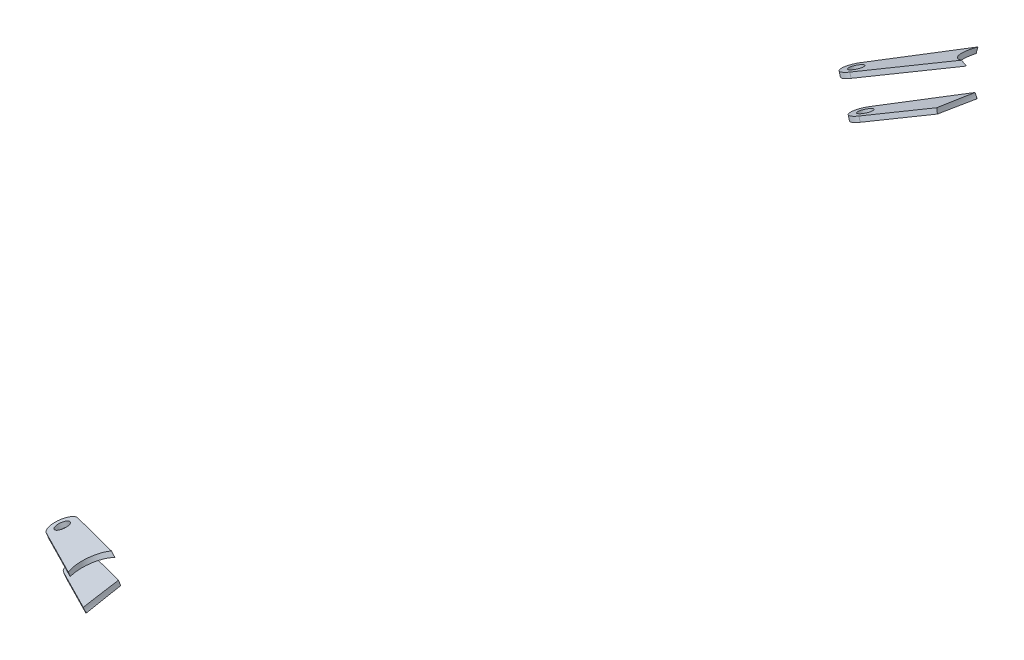
ISO-10303-21;
HEADER;
FILE_DESCRIPTION(('STEP AP214'),'2;1');
FILE_NAME('part.step','',(''),(''),'','','');
FILE_SCHEMA(('AUTOMOTIVE_DESIGN { 1 0 10303 214 1 1 1 1 }'));
ENDSEC;
DATA;
#1=APPLICATION_CONTEXT('core data for automotive mechanical design processes');
#2=APPLICATION_PROTOCOL_DEFINITION('international standard','automotive_design',2000,#1);
#3=PRODUCT_CONTEXT('',#1,'mechanical');
#4=PRODUCT('Part','Part','',(#3));
#5=PRODUCT_RELATED_PRODUCT_CATEGORY('part','',(#4));
#6=PRODUCT_DEFINITION_FORMATION('','',#4);
#7=PRODUCT_DEFINITION_CONTEXT('part definition',#1,'design');
#8=PRODUCT_DEFINITION('design','',#6,#7);
#9=PRODUCT_DEFINITION_SHAPE('','',#8);
#10=(LENGTH_UNIT() NAMED_UNIT(*) SI_UNIT(.MILLI.,.METRE.));
#11=(NAMED_UNIT(*) PLANE_ANGLE_UNIT() SI_UNIT($,.RADIAN.));
#12=(NAMED_UNIT(*) SI_UNIT($,.STERADIAN.) SOLID_ANGLE_UNIT());
#13=UNCERTAINTY_MEASURE_WITH_UNIT(LENGTH_MEASURE(1.E-05),#10,'distance_accuracy_value','');
#14=(GEOMETRIC_REPRESENTATION_CONTEXT(3) GLOBAL_UNCERTAINTY_ASSIGNED_CONTEXT((#13)) GLOBAL_UNIT_ASSIGNED_CONTEXT((#10,
#11,#12)) REPRESENTATION_CONTEXT('',''));
#15=CARTESIAN_POINT('',(0.,0.,0.));
#16=DIRECTION('',(0.,0.,1.));
#17=DIRECTION('',(1.,0.,0.));
#18=AXIS2_PLACEMENT_3D('',#15,#16,#17);
#19=CARTESIAN_POINT('',(-723.135401716286,128.133003214821,253.501979836922));
#20=DIRECTION('',(-0.405383190309539,0.9055830654316,0.124835013589804));
#21=DIRECTION('',(-0.912722826923479,-0.408579296113757,0.));
#22=AXIS2_PLACEMENT_3D('',#19,#20,#21);
#23=CYLINDRICAL_SURFACE('',#22,4.10000000000005);
#24=CARTESIAN_POINT('',(-723.135401716286,128.133003214821,253.501979836922));
#25=DIRECTION('',(-0.405383190309539,0.9055830654316,0.124835013589804));
#26=DIRECTION('',(0.912722826923479,0.408579296113757,0.));
#27=AXIS2_PLACEMENT_3D('',#24,#25,#26);
#28=CIRCLE('',#27,4.10000000000005);
#29=CARTESIAN_POINT('',(-719.393238125899,129.808178328888,253.501979836922));
#30=VERTEX_POINT('',#29);
#31=EDGE_CURVE('E135',#30,#30,#28,.T.);
#32=ORIENTED_EDGE('',*,*,#31,.F.);
#33=EDGE_LOOP('',(#32));
#34=FACE_BOUND('',#33,.T.);
#35=CARTESIAN_POINT('',(-724.351551287214,130.849752411116,253.876484877692));
#36=DIRECTION('',(-0.405383190309539,0.9055830654316,0.124835013589804));
#37=DIRECTION('',(0.912722826923479,0.408579296113757,0.));
#38=AXIS2_PLACEMENT_3D('',#35,#36,#37);
#39=CIRCLE('',#38,4.10000000000005);
#40=CARTESIAN_POINT('',(-720.609387696828,132.524927525183,253.876484877692));
#41=VERTEX_POINT('',#40);
#42=EDGE_CURVE('E123',#41,#41,#39,.T.);
#43=ORIENTED_EDGE('',*,*,#42,.T.);
#44=EDGE_LOOP('',(#43));
#45=FACE_BOUND('',#44,.T.);
#46=ADVANCED_FACE('F52',(#34,#45),#23,.F.);
#47=CARTESIAN_POINT('',(-723.135401716286,128.133003214821,253.501979836922));
#48=DIRECTION('',(-0.405383190309539,0.9055830654316,0.124835013589804));
#49=DIRECTION('',(-0.912722826923479,-0.408579296113757,0.));
#50=AXIS2_PLACEMENT_3D('',#47,#48,#49);
#51=CYLINDRICAL_SURFACE('',#50,8.00000000000009);
#52=CARTESIAN_POINT('',(-724.351551287214,130.849752411116,253.876484877692));
#53=DIRECTION('',(-0.405383190309539,0.9055830654316,0.124835013589804));
#54=DIRECTION('',(0.912722826923479,0.408579296113757,0.));
#55=AXIS2_PLACEMENT_3D('',#52,#53,#54);
#56=CIRCLE('',#55,8.00000000000009);
#57=CARTESIAN_POINT('',(-721.412607697438,133.141206407969,246.797512554224));
#58=VERTEX_POINT('',#57);
#59=CARTESIAN_POINT('',(-727.995069649261,128.301918278556,260.527297999288));
#60=VERTEX_POINT('',#59);
#61=EDGE_CURVE('E115',#58,#60,#56,.T.);
#62=ORIENTED_EDGE('',*,*,#61,.F.);
#63=DIRECTION('',(-0.405383190309539,0.9055830654316,0.124835013589804));
#64=VECTOR('',#63,1.);
#65=CARTESIAN_POINT('',(-720.19645812651,130.424457211674,246.423007513454));
#66=LINE('',#65,#64);
#67=CARTESIAN_POINT('',(-720.19645812651,130.424457211674,246.423007513454));
#68=VERTEX_POINT('',#67);
#69=EDGE_CURVE('E129',#68,#58,#66,.T.);
#70=ORIENTED_EDGE('',*,*,#69,.F.);
#71=CARTESIAN_POINT('',(-723.135401716286,128.133003214821,253.501979836922));
#72=DIRECTION('',(-0.405383190309539,0.9055830654316,0.124835013589804));
#73=DIRECTION('',(0.912722826923479,0.408579296113757,0.));
#74=AXIS2_PLACEMENT_3D('',#71,#72,#73);
#75=CIRCLE('',#74,8.00000000000009);
#76=CARTESIAN_POINT('',(-726.778920078332,125.585169082261,260.152792958518));
#77=VERTEX_POINT('',#76);
#78=EDGE_CURVE('E12',#68,#77,#75,.T.);
#79=ORIENTED_EDGE('',*,*,#78,.T.);
#80=DIRECTION('',(-0.405383190309539,0.9055830654316,0.124835013589804));
#81=VECTOR('',#80,1.);
#82=CARTESIAN_POINT('',(-726.778920078332,125.585169082261,260.152792958518));
#83=LINE('',#82,#81);
#84=EDGE_CURVE('E126',#77,#60,#83,.T.);
#85=ORIENTED_EDGE('',*,*,#84,.T.);
#86=EDGE_LOOP('',(#62,#70,#79,#85));
#87=FACE_BOUND('',#86,.T.);
#88=ADVANCED_FACE('F150',(#87),#51,.T.);
#89=CARTESIAN_POINT('',(-342.282932156797,271.666249022261,449.03936727097));
#90=DIRECTION('',(0.367367948721989,0.28643174960655,-0.884871540433485));
#91=DIRECTION('',(0.923568459891075,0.,0.383433566468075));
#92=AXIS2_PLACEMENT_3D('',#89,#90,#91);
#93=PLANE('',#92);
#94=DIRECTION('',(0.837081393453622,0.312851665203875,0.448796809606424));
#95=VECTOR('',#94,1.);
#96=CARTESIAN_POINT('',(-342.282932156797,271.666249022261,449.03936727097));
#97=LINE('',#96,#95);
#98=CARTESIAN_POINT('',(-687.647262102726,142.589427376731,263.874088668727));
#99=VERTEX_POINT('',#98);
#100=EDGE_CURVE('E132',#68,#99,#97,.T.);
#101=ORIENTED_EDGE('',*,*,#100,.F.);
#102=ORIENTED_EDGE('',*,*,#69,.T.);
#103=DIRECTION('',(0.837081393453622,0.312851665203875,0.448796809606424));
#104=VECTOR('',#103,1.);
#105=CARTESIAN_POINT('',(-343.499081727726,274.382998218555,449.413872311739));
#106=LINE('',#105,#104);
#107=CARTESIAN_POINT('',(-688.64246045726,145.388755109018,264.367055548181));
#108=VERTEX_POINT('',#107);
#109=EDGE_CURVE('E116',#58,#108,#106,.T.);
#110=ORIENTED_EDGE('',*,*,#109,.T.);
#111=CARTESIAN_POINT('',(-676.260714615963,148.214063927805,270.422075372678));
#112=DIRECTION('',(-0.367367948721989,-0.28643174960655,0.884871540433485));
#113=DIRECTION('',(0.69782940423287,0.544088012785731,0.465835117751841));
#114=AXIS2_PLACEMENT_3D('',#111,#112,#113);
#115=ELLIPSE('',#114,14.352365761225,12.7);
#116=EDGE_CURVE('E117',#99,#108,#115,.F.);
#117=ORIENTED_EDGE('',*,*,#116,.F.);
#118=EDGE_LOOP('',(#101,#102,#110,#117));
#119=FACE_BOUND('',#118,.T.);
#120=ADVANCED_FACE('F152',(#119),#93,.T.);
#121=CARTESIAN_POINT('',(-179.920385092426,401.923063808397,55.4052665601296));
#122=DIRECTION('',(0.405383190309539,-0.9055830654316,-0.124835013589804));
#123=DIRECTION('',(0.912722826923479,0.408579296113757,0.));
#124=AXIS2_PLACEMENT_3D('',#121,#122,#123);
#125=PLANE('',#124);
#126=CARTESIAN_POINT('',(-676.260714615963,148.214063927805,284.079472273869));
#127=DIRECTION('',(-0.405383190309539,0.9055830654316,0.124835013589804));
#128=DIRECTION('',(0.0510050019828735,-0.113939766502717,0.99217751404778));
#129=AXIS2_PLACEMENT_3D('',#126,#127,#128);
#130=ELLIPSE('',#129,101.734278186815,12.7);
#131=CARTESIAN_POINT('',(-687.636303718546,142.56729736904,288.101930024843));
#132=VERTEX_POINT('',#131);
#133=EDGE_CURVE('E107',#132,#108,#130,.F.);
#134=ORIENTED_EDGE('',*,*,#133,.T.);
#135=ORIENTED_EDGE('',*,*,#109,.F.);
#136=ORIENTED_EDGE('',*,*,#61,.T.);
#137=DIRECTION('',(-0.792615330353773,-0.280161147143036,-0.541544707036896));
#138=VECTOR('',#137,1.);
#139=CARTESIAN_POINT('',(-410.958717786264,240.362920157407,477.138498558658));
#140=LINE('',#139,#138);
#141=EDGE_CURVE('E56',#132,#60,#140,.T.);
#142=ORIENTED_EDGE('',*,*,#141,.F.);
#143=EDGE_LOOP('',(#134,#135,#136,#142));
#144=FACE_BOUND('',#143,.T.);
#145=ORIENTED_EDGE('',*,*,#42,.F.);
#146=EDGE_LOOP('',(#145));
#147=FACE_BOUND('',#146,.T.);
#148=ADVANCED_FACE('F111',(#144,#147),#125,.F.);
#149=CARTESIAN_POINT('',(-676.260714615963,148.214063927805,-291.982195578493));
#150=DIRECTION('',(0.,0.,1.));
#151=DIRECTION('',(-1.,0.,0.));
#152=AXIS2_PLACEMENT_3D('',#149,#150,#151);
#153=CYLINDRICAL_SURFACE('',#152,12.7);
#154=CARTESIAN_POINT('',(-676.260714615963,148.214063927805,291.982195578493));
#155=DIRECTION('',(-0.143288404120598,0.617337174610734,-0.773539427623575));
#156=DIRECTION('',(-0.174894751333007,0.753508508276034,0.633748178626015));
#157=AXIS2_PLACEMENT_3D('',#154,#155,#156);
#158=ELLIPSE('',#157,16.4180383655637,12.7);
#159=CARTESIAN_POINT('',(-686.020470303491,140.087738256275,287.304705351432));
#160=VERTEX_POINT('',#159);
#161=CARTESIAN_POINT('',(-686.596866626299,140.834771169064,288.007658656125));
#162=VERTEX_POINT('',#161);
#163=EDGE_CURVE('E121',#160,#162,#158,.T.);
#164=ORIENTED_EDGE('',*,*,#163,.F.);
#165=CARTESIAN_POINT('',(-676.260714615963,148.214063927805,260.047753017142));
#166=DIRECTION('',(-0.405383190309539,0.9055830654316,0.124835013589804));
#167=DIRECTION('',(0.0510050019828735,-0.113939766502717,0.99217751404778));
#168=AXIS2_PLACEMENT_3D('',#165,#166,#167);
#169=ELLIPSE('',#168,101.734278186815,12.7);
#170=EDGE_CURVE('E62',#160,#99,#169,.F.);
#171=ORIENTED_EDGE('',*,*,#170,.T.);
#172=ORIENTED_EDGE('',*,*,#116,.T.);
#173=ORIENTED_EDGE('',*,*,#133,.F.);
#174=CARTESIAN_POINT('',(-676.260714615963,148.214063927805,296.497022674504));
#175=DIRECTION('',(0.455439795255794,0.318479266570062,-0.831351640199474));
#176=DIRECTION('',(0.681300647595598,0.476418909414996,0.555746750181811));
#177=AXIS2_PLACEMENT_3D('',#174,#175,#176);
#178=ELLIPSE('',#177,15.2763275922001,12.7);
#179=EDGE_CURVE('E96',#132,#162,#178,.F.);
#180=ORIENTED_EDGE('',*,*,#179,.T.);
#181=EDGE_LOOP('',(#164,#171,#172,#173,#180));
#182=FACE_BOUND('',#181,.T.);
#183=ADVANCED_FACE('F118',(#182),#153,.F.);
#184=CARTESIAN_POINT('',(-409.742568215335,237.646170961112,476.763993517889));
#185=DIRECTION('',(-0.455439795255794,-0.318479266570062,0.831351640199474));
#186=DIRECTION('',(-0.877018125804204,0.,-0.480457289476266));
#187=AXIS2_PLACEMENT_3D('',#184,#185,#186);
#188=PLANE('',#187);
#189=ORIENTED_EDGE('',*,*,#179,.F.);
#190=ORIENTED_EDGE('',*,*,#141,.T.);
#191=ORIENTED_EDGE('',*,*,#84,.F.);
#192=DIRECTION('',(-0.792615330353773,-0.280161147143036,-0.541544707036896));
#193=VECTOR('',#192,1.);
#194=CARTESIAN_POINT('',(-409.742568215335,237.646170961112,476.763993517889));
#195=LINE('',#194,#193);
#196=CARTESIAN_POINT('',(-686.232874586171,139.916744793934,287.855381448393));
#197=VERTEX_POINT('',#196);
#198=EDGE_CURVE('E128',#197,#77,#195,.T.);
#199=ORIENTED_EDGE('',*,*,#198,.F.);
#200=CARTESIAN_POINT('',(-673.992049395208,138.439850961207,293.99550147373));
#201=DIRECTION('',(0.455439795255794,0.318479266570062,-0.831351640199474));
#202=DIRECTION('',(-0.417830240767277,0.901053090893115,0.116280769228294));
#203=AXIS2_PLACEMENT_3D('',#200,#201,#202);
#204=ELLIPSE('',#203,34.6277885790125,12.7);
#205=EDGE_CURVE('E102',#162,#197,#204,.F.);
#206=ORIENTED_EDGE('',*,*,#205,.F.);
#207=EDGE_LOOP('',(#189,#190,#191,#199,#206));
#208=FACE_BOUND('',#207,.T.);
#209=ADVANCED_FACE('F98',(#208),#188,.T.);
#210=CARTESIAN_POINT('',(-178.704235521497,399.206314612102,55.0307615193602));
#211=DIRECTION('',(0.405383190309539,-0.9055830654316,-0.124835013589804));
#212=DIRECTION('',(0.912722826923479,0.408579296113757,0.));
#213=AXIS2_PLACEMENT_3D('',#210,#211,#212);
#214=PLANE('',#213);
#215=ORIENTED_EDGE('',*,*,#31,.T.);
#216=EDGE_LOOP('',(#215));
#217=FACE_BOUND('',#216,.T.);
#218=ORIENTED_EDGE('',*,*,#198,.T.);
#219=ORIENTED_EDGE('',*,*,#78,.F.);
#220=ORIENTED_EDGE('',*,*,#100,.T.);
#221=ORIENTED_EDGE('',*,*,#170,.F.);
#222=CARTESIAN_POINT('',(-675.310673341131,144.120949764326,292.825300890745));
#223=DIRECTION('',(-0.405383190309539,0.9055830654316,0.124835013589804));
#224=DIRECTION('',(0.423400282953569,0.307028627372305,-0.852329526866643));
#225=AXIS2_PLACEMENT_3D('',#222,#223,#224);
#226=ELLIPSE('',#225,13.6529640296189,12.7);
#227=EDGE_CURVE('E69',#197,#160,#226,.F.);
#228=ORIENTED_EDGE('',*,*,#227,.F.);
#229=EDGE_LOOP('',(#218,#219,#220,#221,#228));
#230=FACE_BOUND('',#229,.T.);
#231=ADVANCED_FACE('F54',(#217,#230),#214,.T.);
#232=CARTESIAN_POINT('',(-676.260714615963,148.214063927805,291.982195578494));
#233=DIRECTION('',(-0.221678460217085,0.955069289398282,-0.196726492176431));
#234=DIRECTION('',(-0.97410485020902,-0.226096750970159,0.));
#235=AXIS2_PLACEMENT_3D('',#232,#233,#234);
#236=CYLINDRICAL_SURFACE('',#235,12.7);
#237=ORIENTED_EDGE('',*,*,#205,.T.);
#238=ORIENTED_EDGE('',*,*,#227,.T.);
#239=ORIENTED_EDGE('',*,*,#163,.T.);
#240=EDGE_LOOP('',(#237,#238,#239));
#241=FACE_BOUND('',#240,.T.);
#242=ADVANCED_FACE('F146',(#241),#236,.F.);
#243=CLOSED_SHELL('',(#46,#88,#120,#148,#183,#209,#231,#242));
#244=MANIFOLD_SOLID_BREP('B2',#243);
#245=CARTESIAN_POINT('',(-419.471764782764,259.380164531471,479.760033844044));
#246=DIRECTION('',(-0.455439795255794,-0.318479266570062,0.831351640199474));
#247=DIRECTION('',(-0.637395705653935,-0.535291080076917,-0.554247394223924));
#248=AXIS2_PLACEMENT_3D('',#245,#246,#247);
#249=PLANE('',#248);
#250=DIRECTION('',(-0.792615330353772,-0.280161147143037,-0.541544707036896));
#251=VECTOR('',#250,1.);
#252=CARTESIAN_POINT('',(-419.471764782764,259.380164531471,479.760033844044));
#253=LINE('',#252,#251);
#254=CARTESIAN_POINT('',(-691.538553287296,163.214293587578,293.873736124576));
#255=VERTEX_POINT('',#254);
#256=CARTESIAN_POINT('',(-736.508116645761,147.319162652619,263.148833284673));
#257=VERTEX_POINT('',#256);
#258=EDGE_CURVE('E307',#255,#257,#253,.T.);
#259=ORIENTED_EDGE('',*,*,#258,.T.);
#260=DIRECTION('',(0.40538319030954,-0.9055830654316,-0.124835013589804));
#261=VECTOR('',#260,1.);
#262=CARTESIAN_POINT('',(-736.508116645761,147.319162652619,263.148833284673));
#263=LINE('',#262,#261);
#264=CARTESIAN_POINT('',(-735.291967074832,144.602413456324,262.774328243904));
#265=VERTEX_POINT('',#264);
#266=EDGE_CURVE('E299',#257,#265,#263,.T.);
#267=ORIENTED_EDGE('',*,*,#266,.T.);
#268=DIRECTION('',(-0.792615330353772,-0.280161147143037,-0.541544707036896));
#269=VECTOR('',#268,1.);
#270=CARTESIAN_POINT('',(-418.255615211836,256.663415335176,479.385528803275));
#271=LINE('',#270,#269);
#272=CARTESIAN_POINT('',(-691.502976842537,160.080254050499,292.692618969123));
#273=VERTEX_POINT('',#272);
#274=EDGE_CURVE('E288',#273,#265,#271,.T.);
#275=ORIENTED_EDGE('',*,*,#274,.F.);
#276=CARTESIAN_POINT('',(-673.992049395208,138.439850961207,293.99550147373));
#277=DIRECTION('',(0.455439795255794,0.318479266570062,-0.831351640199474));
#278=DIRECTION('',(-0.417830240767277,0.901053090893115,0.116280769228294));
#279=AXIS2_PLACEMENT_3D('',#276,#277,#278);
#280=ELLIPSE('',#279,34.6277885790125,12.7);
#281=EDGE_CURVE('E292',#255,#273,#280,.F.);
#282=ORIENTED_EDGE('',*,*,#281,.F.);
#283=EDGE_LOOP('',(#259,#267,#275,#282));
#284=FACE_BOUND('',#283,.T.);
#285=ADVANCED_FACE('F243',(#284),#249,.T.);
#286=CARTESIAN_POINT('',(-188.433432088926,420.940308182461,58.0268018455155));
#287=DIRECTION('',(-0.40538319030954,0.9055830654316,0.124835013589803));
#288=DIRECTION('',(0.912722826923479,0.408579296113757,0.));
#289=AXIS2_PLACEMENT_3D('',#286,#287,#288);
#290=PLANE('',#289);
#291=CARTESIAN_POINT('',(-732.864598283714,149.86699678518,256.498020163078));
#292=DIRECTION('',(-0.40538319030954,0.9055830654316,0.124835013589803));
#293=DIRECTION('',(0.912722826923479,0.408579296113757,0.));
#294=AXIS2_PLACEMENT_3D('',#291,#292,#293);
#295=CIRCLE('',#294,4.10000000000005);
#296=CARTESIAN_POINT('',(-729.122434693328,151.542171899246,256.498020163078));
#297=VERTEX_POINT('',#296);
#298=EDGE_CURVE('E300',#297,#297,#295,.T.);
#299=ORIENTED_EDGE('',*,*,#298,.F.);
#300=EDGE_LOOP('',(#299));
#301=FACE_BOUND('',#300,.T.);
#302=DIRECTION('',(0.837081393453622,0.312851665203875,0.448796809606424));
#303=VECTOR('',#302,1.);
#304=CARTESIAN_POINT('',(-352.012128724226,293.400242592619,452.035407597125));
#305=LINE('',#304,#303);
#306=CARTESIAN_POINT('',(-729.925654693939,152.158450782032,249.41904783961));
#307=VERTEX_POINT('',#306);
#308=CARTESIAN_POINT('',(-682.909083565255,169.730472672398,274.626736466075));
#309=VERTEX_POINT('',#308);
#310=EDGE_CURVE('E303',#307,#309,#305,.T.);
#311=ORIENTED_EDGE('',*,*,#310,.F.);
#312=CARTESIAN_POINT('',(-732.864598283714,149.86699678518,256.498020163078));
#313=DIRECTION('',(-0.40538319030954,0.9055830654316,0.124835013589803));
#314=DIRECTION('',(0.912722826923479,0.408579296113757,0.));
#315=AXIS2_PLACEMENT_3D('',#312,#313,#314);
#316=CIRCLE('',#315,8.00000000000009);
#317=EDGE_CURVE('E314',#307,#257,#316,.T.);
#318=ORIENTED_EDGE('',*,*,#317,.T.);
#319=ORIENTED_EDGE('',*,*,#258,.F.);
#320=CARTESIAN_POINT('',(-681.030172005985,168.762574937142,287.749584881879));
#321=DIRECTION('',(0.40538319030954,-0.9055830654316,-0.124835013589803));
#322=DIRECTION('',(0.42340028295357,0.307028627372305,-0.852329526866643));
#323=AXIS2_PLACEMENT_3D('',#320,#321,#322);
#324=ELLIPSE('',#323,13.6529640296189,12.7);
#325=EDGE_CURVE('E293',#309,#255,#324,.F.);
#326=ORIENTED_EDGE('',*,*,#325,.F.);
#327=EDGE_LOOP('',(#311,#318,#319,#326));
#328=FACE_BOUND('',#327,.T.);
#329=ADVANCED_FACE('F335',(#301,#328),#290,.T.);
#330=CARTESIAN_POINT('',(-187.217282517997,418.223558986166,57.6522968047461));
#331=DIRECTION('',(-0.40538319030954,0.9055830654316,0.124835013589803));
#332=DIRECTION('',(0.912722826923479,0.408579296113757,0.));
#333=AXIS2_PLACEMENT_3D('',#330,#331,#332);
#334=PLANE('',#333);
#335=CARTESIAN_POINT('',(-680.315234672878,165.68237179054,288.384049382988));
#336=DIRECTION('',(0.40538319030954,-0.9055830654316,-0.124835013589803));
#337=DIRECTION('',(0.42340028295357,0.307028627372305,-0.852329526866643));
#338=AXIS2_PLACEMENT_3D('',#335,#336,#337);
#339=ELLIPSE('',#338,13.6529640296189,12.7);
#340=CARTESIAN_POINT('',(-680.149753040607,167.590473520791,275.079599819933));
#341=VERTEX_POINT('',#340);
#342=EDGE_CURVE('E50',#341,#273,#339,.F.);
#343=ORIENTED_EDGE('',*,*,#342,.T.);
#344=ORIENTED_EDGE('',*,*,#274,.T.);
#345=CARTESIAN_POINT('',(-731.648448712786,147.150247588885,256.123515122308));
#346=DIRECTION('',(-0.40538319030954,0.9055830654316,0.124835013589803));
#347=DIRECTION('',(0.912722826923479,0.408579296113757,0.));
#348=AXIS2_PLACEMENT_3D('',#345,#346,#347);
#349=CIRCLE('',#348,8.00000000000009);
#350=CARTESIAN_POINT('',(-728.70950512301,149.441701585737,249.04454279884));
#351=VERTEX_POINT('',#350);
#352=EDGE_CURVE('E309',#351,#265,#349,.T.);
#353=ORIENTED_EDGE('',*,*,#352,.F.);
#354=DIRECTION('',(0.837081393453622,0.312851665203875,0.448796809606424));
#355=VECTOR('',#354,1.);
#356=CARTESIAN_POINT('',(-350.795979153297,290.683493396324,451.660902556356));
#357=LINE('',#356,#355);
#358=EDGE_CURVE('E290',#351,#341,#357,.T.);
#359=ORIENTED_EDGE('',*,*,#358,.T.);
#360=EDGE_LOOP('',(#343,#344,#353,#359));
#361=FACE_BOUND('',#360,.T.);
#362=CARTESIAN_POINT('',(-731.648448712786,147.150247588885,256.123515122308));
#363=DIRECTION('',(-0.40538319030954,0.9055830654316,0.124835013589803));
#364=DIRECTION('',(0.912722826923479,0.408579296113757,0.));
#365=AXIS2_PLACEMENT_3D('',#362,#363,#364);
#366=CIRCLE('',#365,4.10000000000005);
#367=CARTESIAN_POINT('',(-727.9062851224,148.825422702951,256.123515122308));
#368=VERTEX_POINT('',#367);
#369=EDGE_CURVE('E310',#368,#368,#366,.T.);
#370=ORIENTED_EDGE('',*,*,#369,.T.);
#371=EDGE_LOOP('',(#370));
#372=FACE_BOUND('',#371,.T.);
#373=ADVANCED_FACE('F284',(#361,#372),#334,.F.);
#374=CARTESIAN_POINT('',(-732.864598283714,149.86699678518,256.498020163078));
#375=DIRECTION('',(0.40538319030954,-0.9055830654316,-0.124835013589804));
#376=DIRECTION('',(-0.912722826923479,-0.408579296113757,0.));
#377=AXIS2_PLACEMENT_3D('',#374,#375,#376);
#378=CYLINDRICAL_SURFACE('',#377,8.00000000000009);
#379=ORIENTED_EDGE('',*,*,#352,.T.);
#380=ORIENTED_EDGE('',*,*,#266,.F.);
#381=ORIENTED_EDGE('',*,*,#317,.F.);
#382=DIRECTION('',(0.40538319030954,-0.9055830654316,-0.124835013589804));
#383=VECTOR('',#382,1.);
#384=CARTESIAN_POINT('',(-729.925654693939,152.158450782032,249.41904783961));
#385=LINE('',#384,#383);
#386=EDGE_CURVE('E253',#307,#351,#385,.T.);
#387=ORIENTED_EDGE('',*,*,#386,.T.);
#388=EDGE_LOOP('',(#379,#380,#381,#387));
#389=FACE_BOUND('',#388,.T.);
#390=ADVANCED_FACE('F323',(#389),#378,.T.);
#391=CARTESIAN_POINT('',(-732.864598283714,149.86699678518,256.498020163078));
#392=DIRECTION('',(0.40538319030954,-0.9055830654316,-0.124835013589804));
#393=DIRECTION('',(-0.912722826923479,-0.408579296113757,0.));
#394=AXIS2_PLACEMENT_3D('',#391,#392,#393);
#395=CYLINDRICAL_SURFACE('',#394,4.10000000000005);
#396=ORIENTED_EDGE('',*,*,#298,.T.);
#397=EDGE_LOOP('',(#396));
#398=FACE_BOUND('',#397,.T.);
#399=ORIENTED_EDGE('',*,*,#369,.F.);
#400=EDGE_LOOP('',(#399));
#401=FACE_BOUND('',#400,.T.);
#402=ADVANCED_FACE('F326',(#398,#401),#395,.F.);
#403=CARTESIAN_POINT('',(-352.012128724226,293.400242592619,452.035407597125));
#404=DIRECTION('',(0.367367948721989,0.28643174960655,-0.884871540433485));
#405=DIRECTION('',(0.658826323829652,0.591405862044624,0.464959117953785));
#406=AXIS2_PLACEMENT_3D('',#403,#404,#405);
#407=PLANE('',#406);
#408=ORIENTED_EDGE('',*,*,#358,.F.);
#409=ORIENTED_EDGE('',*,*,#386,.F.);
#410=ORIENTED_EDGE('',*,*,#310,.T.);
#411=CARTESIAN_POINT('',(-687.809434746994,197.970038947669,281.73339107904));
#412=DIRECTION('',(-0.367367948721989,-0.28643174960655,0.884871540433485));
#413=DIRECTION('',(-0.382800579522227,0.913643315180279,0.136819621925503));
#414=AXIS2_PLACEMENT_3D('',#411,#412,#413);
#415=ELLIPSE('',#414,34.6802864845066,12.7);
#416=EDGE_CURVE('E247',#341,#309,#415,.F.);
#417=ORIENTED_EDGE('',*,*,#416,.F.);
#418=EDGE_LOOP('',(#408,#409,#410,#417));
#419=FACE_BOUND('',#418,.T.);
#420=ADVANCED_FACE('F324',(#419),#407,.T.);
#421=CARTESIAN_POINT('',(-676.260714615963,148.214063927805,291.982195578494));
#422=DIRECTION('',(-0.221678460217085,0.955069289398282,-0.196726492176431));
#423=DIRECTION('',(-0.97410485020902,-0.226096750970159,0.));
#424=AXIS2_PLACEMENT_3D('',#421,#422,#423);
#425=CYLINDRICAL_SURFACE('',#424,12.7);
#426=ORIENTED_EDGE('',*,*,#416,.T.);
#427=ORIENTED_EDGE('',*,*,#325,.T.);
#428=ORIENTED_EDGE('',*,*,#281,.T.);
#429=ORIENTED_EDGE('',*,*,#342,.F.);
#430=EDGE_LOOP('',(#426,#427,#428,#429));
#431=FACE_BOUND('',#430,.T.);
#432=ADVANCED_FACE('F245',(#431),#425,.F.);
#433=CLOSED_SHELL('',(#285,#329,#373,#390,#402,#420,#432));
#434=MANIFOLD_SOLID_BREP('B6',#433);
#435=CARTESIAN_POINT('',(-723.135401716286,128.133003214821,-253.501979836922));
#436=DIRECTION('',(-0.405383190309539,0.9055830654316,-0.124835013589804));
#437=DIRECTION('',(-0.912722826923479,-0.408579296113757,0.));
#438=AXIS2_PLACEMENT_3D('',#435,#436,#437);
#439=CYLINDRICAL_SURFACE('',#438,4.10000000000005);
#440=CARTESIAN_POINT('',(-723.135401716286,128.133003214821,-253.501979836922));
#441=DIRECTION('',(0.405383190309539,-0.9055830654316,0.124835013589804));
#442=DIRECTION('',(0.912722826923479,0.408579296113757,0.));
#443=AXIS2_PLACEMENT_3D('',#440,#441,#442);
#444=CIRCLE('',#443,4.10000000000005);
#445=CARTESIAN_POINT('',(-719.393238125899,129.808178328888,-253.501979836922));
#446=VERTEX_POINT('',#445);
#447=EDGE_CURVE('E500',#446,#446,#444,.T.);
#448=ORIENTED_EDGE('',*,*,#447,.T.);
#449=EDGE_LOOP('',(#448));
#450=FACE_BOUND('',#449,.T.);
#451=CARTESIAN_POINT('',(-724.351551287214,130.849752411116,-253.876484877692));
#452=DIRECTION('',(0.405383190309539,-0.9055830654316,0.124835013589804));
#453=DIRECTION('',(0.912722826923479,0.408579296113757,0.));
#454=AXIS2_PLACEMENT_3D('',#451,#452,#453);
#455=CIRCLE('',#454,4.10000000000005);
#456=CARTESIAN_POINT('',(-720.609387696828,132.524927525183,-253.876484877692));
#457=VERTEX_POINT('',#456);
#458=EDGE_CURVE('E475',#457,#457,#455,.T.);
#459=ORIENTED_EDGE('',*,*,#458,.F.);
#460=EDGE_LOOP('',(#459));
#461=FACE_BOUND('',#460,.T.);
#462=ADVANCED_FACE('F405',(#450,#461),#439,.F.);
#463=CARTESIAN_POINT('',(-723.135401716286,128.133003214821,-253.501979836922));
#464=DIRECTION('',(-0.405383190309539,0.9055830654316,-0.124835013589804));
#465=DIRECTION('',(-0.912722826923479,-0.408579296113757,0.));
#466=AXIS2_PLACEMENT_3D('',#463,#464,#465);
#467=CYLINDRICAL_SURFACE('',#466,8.00000000000009);
#468=CARTESIAN_POINT('',(-724.351551287214,130.849752411116,-253.876484877692));
#469=DIRECTION('',(0.405383190309539,-0.9055830654316,0.124835013589804));
#470=DIRECTION('',(0.912722826923479,0.408579296113757,0.));
#471=AXIS2_PLACEMENT_3D('',#468,#469,#470);
#472=CIRCLE('',#471,8.00000000000009);
#473=CARTESIAN_POINT('',(-721.412607697438,133.141206407969,-246.797512554224));
#474=VERTEX_POINT('',#473);
#475=CARTESIAN_POINT('',(-727.995069649261,128.301918278556,-260.527297999288));
#476=VERTEX_POINT('',#475);
#477=EDGE_CURVE('E495',#474,#476,#472,.T.);
#478=ORIENTED_EDGE('',*,*,#477,.T.);
#479=DIRECTION('',(-0.405383190309539,0.9055830654316,-0.124835013589804));
#480=VECTOR('',#479,1.);
#481=CARTESIAN_POINT('',(-726.778920078332,125.585169082261,-260.152792958518));
#482=LINE('',#481,#480);
#483=CARTESIAN_POINT('',(-726.778920078332,125.585169082261,-260.152792958518));
#484=VERTEX_POINT('',#483);
#485=EDGE_CURVE('E472',#484,#476,#482,.T.);
#486=ORIENTED_EDGE('',*,*,#485,.F.);
#487=CARTESIAN_POINT('',(-723.135401716286,128.133003214821,-253.501979836922));
#488=DIRECTION('',(0.405383190309539,-0.9055830654316,0.124835013589804));
#489=DIRECTION('',(0.912722826923479,0.408579296113757,0.));
#490=AXIS2_PLACEMENT_3D('',#487,#488,#489);
#491=CIRCLE('',#490,8.00000000000009);
#492=CARTESIAN_POINT('',(-720.19645812651,130.424457211674,-246.423007513454));
#493=VERTEX_POINT('',#492);
#494=EDGE_CURVE('E241',#493,#484,#491,.T.);
#495=ORIENTED_EDGE('',*,*,#494,.F.);
#496=DIRECTION('',(-0.405383190309539,0.9055830654316,-0.124835013589804));
#497=VECTOR('',#496,1.);
#498=CARTESIAN_POINT('',(-720.19645812651,130.424457211674,-246.423007513454));
#499=LINE('',#498,#497);
#500=EDGE_CURVE('E481',#493,#474,#499,.T.);
#501=ORIENTED_EDGE('',*,*,#500,.T.);
#502=EDGE_LOOP('',(#478,#486,#495,#501));
#503=FACE_BOUND('',#502,.T.);
#504=ADVANCED_FACE('F494',(#503),#467,.T.);
#505=CARTESIAN_POINT('',(-342.282932156797,271.666249022261,-449.03936727097));
#506=DIRECTION('',(0.367367948721989,0.28643174960655,0.884871540433485));
#507=DIRECTION('',(0.923568459891075,0.,-0.383433566468075));
#508=AXIS2_PLACEMENT_3D('',#505,#506,#507);
#509=PLANE('',#508);
#510=DIRECTION('',(0.837081393453622,0.312851665203875,-0.448796809606424));
#511=VECTOR('',#510,1.);
#512=CARTESIAN_POINT('',(-342.282932156797,271.666249022261,-449.03936727097));
#513=LINE('',#512,#511);
#514=CARTESIAN_POINT('',(-687.647262102726,142.589427376731,-263.874088668727));
#515=VERTEX_POINT('',#514);
#516=EDGE_CURVE('E477',#493,#515,#513,.T.);
#517=ORIENTED_EDGE('',*,*,#516,.T.);
#518=CARTESIAN_POINT('',(-676.260714615963,148.214063927805,-270.422075372678));
#519=DIRECTION('',(0.367367948721989,0.28643174960655,0.884871540433485));
#520=DIRECTION('',(0.69782940423287,0.544088012785731,-0.465835117751841));
#521=AXIS2_PLACEMENT_3D('',#518,#519,#520);
#522=ELLIPSE('',#521,14.352365761225,12.7);
#523=CARTESIAN_POINT('',(-688.64246045726,145.388755109018,-264.367055548181));
#524=VERTEX_POINT('',#523);
#525=EDGE_CURVE('E474',#515,#524,#522,.F.);
#526=ORIENTED_EDGE('',*,*,#525,.T.);
#527=DIRECTION('',(0.837081393453622,0.312851665203875,-0.448796809606424));
#528=VECTOR('',#527,1.);
#529=CARTESIAN_POINT('',(-343.499081727726,274.382998218555,-449.413872311739));
#530=LINE('',#529,#528);
#531=EDGE_CURVE('E468',#474,#524,#530,.T.);
#532=ORIENTED_EDGE('',*,*,#531,.F.);
#533=ORIENTED_EDGE('',*,*,#500,.F.);
#534=EDGE_LOOP('',(#517,#526,#532,#533));
#535=FACE_BOUND('',#534,.T.);
#536=ADVANCED_FACE('F504',(#535),#509,.T.);
#537=CARTESIAN_POINT('',(-179.920385092426,401.923063808397,-55.4052665601296));
#538=DIRECTION('',(0.405383190309539,-0.9055830654316,0.124835013589804));
#539=DIRECTION('',(0.912722826923479,0.408579296113757,0.));
#540=AXIS2_PLACEMENT_3D('',#537,#538,#539);
#541=PLANE('',#540);
#542=CARTESIAN_POINT('',(-676.260714615963,148.214063927805,-284.079472273869));
#543=DIRECTION('',(0.405383190309539,-0.9055830654316,0.124835013589804));
#544=DIRECTION('',(0.0510050019828735,-0.113939766502717,-0.99217751404778));
#545=AXIS2_PLACEMENT_3D('',#542,#543,#544);
#546=ELLIPSE('',#545,101.734278186815,12.7);
#547=CARTESIAN_POINT('',(-687.636303718546,142.56729736904,-288.101930024843));
#548=VERTEX_POINT('',#547);
#549=EDGE_CURVE('E453',#548,#524,#546,.F.);
#550=ORIENTED_EDGE('',*,*,#549,.F.);
#551=DIRECTION('',(-0.792615330353773,-0.280161147143036,0.541544707036896));
#552=VECTOR('',#551,1.);
#553=CARTESIAN_POINT('',(-410.958717786264,240.362920157407,-477.138498558658));
#554=LINE('',#553,#552);
#555=EDGE_CURVE('E409',#548,#476,#554,.T.);
#556=ORIENTED_EDGE('',*,*,#555,.T.);
#557=ORIENTED_EDGE('',*,*,#477,.F.);
#558=ORIENTED_EDGE('',*,*,#531,.T.);
#559=EDGE_LOOP('',(#550,#556,#557,#558));
#560=FACE_BOUND('',#559,.T.);
#561=ORIENTED_EDGE('',*,*,#458,.T.);
#562=EDGE_LOOP('',(#561));
#563=FACE_BOUND('',#562,.T.);
#564=ADVANCED_FACE('F463',(#560,#563),#541,.F.);
#565=CARTESIAN_POINT('',(-676.260714615963,148.214063927805,291.982195578493));
#566=DIRECTION('',(0.,0.,-1.));
#567=DIRECTION('',(-1.,0.,0.));
#568=AXIS2_PLACEMENT_3D('',#565,#566,#567);
#569=CYLINDRICAL_SURFACE('',#568,12.7);
#570=CARTESIAN_POINT('',(-676.260714615963,148.214063927805,-291.982195578493));
#571=DIRECTION('',(0.143288404120598,-0.617337174610734,-0.773539427623575));
#572=DIRECTION('',(-0.174894751333007,0.753508508276034,-0.633748178626015));
#573=AXIS2_PLACEMENT_3D('',#570,#571,#572);
#574=ELLIPSE('',#573,16.4180383655637,12.7);
#575=CARTESIAN_POINT('',(-686.020470303491,140.087738256275,-287.304705351432));
#576=VERTEX_POINT('',#575);
#577=CARTESIAN_POINT('',(-686.596866626299,140.834771169064,-288.007658656125));
#578=VERTEX_POINT('',#577);
#579=EDGE_CURVE('E456',#576,#578,#574,.T.);
#580=ORIENTED_EDGE('',*,*,#579,.T.);
#581=CARTESIAN_POINT('',(-676.260714615963,148.214063927805,-296.497022674504));
#582=DIRECTION('',(-0.455439795255794,-0.318479266570062,-0.831351640199474));
#583=DIRECTION('',(0.681300647595598,0.476418909414996,-0.555746750181811));
#584=AXIS2_PLACEMENT_3D('',#581,#582,#583);
#585=ELLIPSE('',#584,15.2763275922001,12.7);
#586=EDGE_CURVE('E450',#548,#578,#585,.F.);
#587=ORIENTED_EDGE('',*,*,#586,.F.);
#588=ORIENTED_EDGE('',*,*,#549,.T.);
#589=ORIENTED_EDGE('',*,*,#525,.F.);
#590=CARTESIAN_POINT('',(-676.260714615963,148.214063927805,-260.047753017142));
#591=DIRECTION('',(0.405383190309539,-0.9055830654316,0.124835013589804));
#592=DIRECTION('',(0.0510050019828735,-0.113939766502717,-0.99217751404778));
#593=AXIS2_PLACEMENT_3D('',#590,#591,#592);
#594=ELLIPSE('',#593,101.734278186815,12.7);
#595=EDGE_CURVE('E415',#576,#515,#594,.F.);
#596=ORIENTED_EDGE('',*,*,#595,.F.);
#597=EDGE_LOOP('',(#580,#587,#588,#589,#596));
#598=FACE_BOUND('',#597,.T.);
#599=ADVANCED_FACE('F452',(#598),#569,.F.);
#600=CARTESIAN_POINT('',(-409.742568215335,237.646170961112,-476.763993517889));
#601=DIRECTION('',(-0.455439795255794,-0.318479266570062,-0.831351640199474));
#602=DIRECTION('',(-0.877018125804204,0.,0.480457289476266));
#603=AXIS2_PLACEMENT_3D('',#600,#601,#602);
#604=PLANE('',#603);
#605=ORIENTED_EDGE('',*,*,#586,.T.);
#606=CARTESIAN_POINT('',(-673.992049395208,138.439850961207,-293.99550147373));
#607=DIRECTION('',(-0.455439795255794,-0.318479266570062,-0.831351640199474));
#608=DIRECTION('',(-0.417830240767277,0.901053090893115,-0.116280769228294));
#609=AXIS2_PLACEMENT_3D('',#606,#607,#608);
#610=ELLIPSE('',#609,34.6277885790125,12.7);
#611=CARTESIAN_POINT('',(-686.232874586171,139.916744793934,-287.855381448393));
#612=VERTEX_POINT('',#611);
#613=EDGE_CURVE('E459',#578,#612,#610,.F.);
#614=ORIENTED_EDGE('',*,*,#613,.T.);
#615=DIRECTION('',(-0.792615330353773,-0.280161147143036,0.541544707036896));
#616=VECTOR('',#615,1.);
#617=CARTESIAN_POINT('',(-409.742568215335,237.646170961112,-476.763993517889));
#618=LINE('',#617,#616);
#619=EDGE_CURVE('E486',#612,#484,#618,.T.);
#620=ORIENTED_EDGE('',*,*,#619,.T.);
#621=ORIENTED_EDGE('',*,*,#485,.T.);
#622=ORIENTED_EDGE('',*,*,#555,.F.);
#623=EDGE_LOOP('',(#605,#614,#620,#621,#622));
#624=FACE_BOUND('',#623,.T.);
#625=ADVANCED_FACE('F470',(#624),#604,.T.);
#626=CARTESIAN_POINT('',(-178.704235521497,399.206314612102,-55.0307615193602));
#627=DIRECTION('',(0.405383190309539,-0.9055830654316,0.124835013589804));
#628=DIRECTION('',(0.912722826923479,0.408579296113757,0.));
#629=AXIS2_PLACEMENT_3D('',#626,#627,#628);
#630=PLANE('',#629);
#631=ORIENTED_EDGE('',*,*,#447,.F.);
#632=EDGE_LOOP('',(#631));
#633=FACE_BOUND('',#632,.T.);
#634=ORIENTED_EDGE('',*,*,#619,.F.);
#635=CARTESIAN_POINT('',(-675.310673341131,144.120949764326,-292.825300890745));
#636=DIRECTION('',(0.405383190309539,-0.9055830654316,0.124835013589804));
#637=DIRECTION('',(0.423400282953569,0.307028627372305,0.852329526866643));
#638=AXIS2_PLACEMENT_3D('',#635,#636,#637);
#639=ELLIPSE('',#638,13.6529640296189,12.7);
#640=EDGE_CURVE('E422',#612,#576,#639,.F.);
#641=ORIENTED_EDGE('',*,*,#640,.T.);
#642=ORIENTED_EDGE('',*,*,#595,.T.);
#643=ORIENTED_EDGE('',*,*,#516,.F.);
#644=ORIENTED_EDGE('',*,*,#494,.T.);
#645=EDGE_LOOP('',(#634,#641,#642,#643,#644));
#646=FACE_BOUND('',#645,.T.);
#647=ADVANCED_FACE('F407',(#633,#646),#630,.T.);
#648=CARTESIAN_POINT('',(-676.260714615963,148.214063927805,-291.982195578494));
#649=DIRECTION('',(-0.221678460217085,0.955069289398282,0.196726492176431));
#650=DIRECTION('',(-0.97410485020902,-0.226096750970159,0.));
#651=AXIS2_PLACEMENT_3D('',#648,#649,#650);
#652=CYLINDRICAL_SURFACE('',#651,12.7);
#653=ORIENTED_EDGE('',*,*,#613,.F.);
#654=ORIENTED_EDGE('',*,*,#579,.F.);
#655=ORIENTED_EDGE('',*,*,#640,.F.);
#656=EDGE_LOOP('',(#653,#654,#655));
#657=FACE_BOUND('',#656,.T.);
#658=ADVANCED_FACE('F523',(#657),#652,.F.);
#659=CLOSED_SHELL('',(#462,#504,#536,#564,#599,#625,#647,#658));
#660=MANIFOLD_SOLID_BREP('B44',#659);
#661=CARTESIAN_POINT('',(-419.471764782764,259.380164531471,-479.760033844044));
#662=DIRECTION('',(-0.455439795255794,-0.318479266570062,-0.831351640199474));
#663=DIRECTION('',(-0.637395705653935,-0.535291080076917,0.554247394223924));
#664=AXIS2_PLACEMENT_3D('',#661,#662,#663);
#665=PLANE('',#664);
#666=DIRECTION('',(-0.792615330353772,-0.280161147143037,0.541544707036896));
#667=VECTOR('',#666,1.);
#668=CARTESIAN_POINT('',(-419.471764782764,259.380164531471,-479.760033844044));
#669=LINE('',#668,#667);
#670=CARTESIAN_POINT('',(-691.538553287296,163.214293587578,-293.873736124576));
#671=VERTEX_POINT('',#670);
#672=CARTESIAN_POINT('',(-736.508116645761,147.319162652619,-263.148833284673));
#673=VERTEX_POINT('',#672);
#674=EDGE_CURVE('E632',#671,#673,#669,.T.);
#675=ORIENTED_EDGE('',*,*,#674,.F.);
#676=CARTESIAN_POINT('',(-673.992049395208,138.439850961207,-293.99550147373));
#677=DIRECTION('',(-0.455439795255794,-0.318479266570062,-0.831351640199474));
#678=DIRECTION('',(-0.417830240767277,0.901053090893115,-0.116280769228294));
#679=AXIS2_PLACEMENT_3D('',#676,#677,#678);
#680=ELLIPSE('',#679,34.6277885790125,12.7);
#681=CARTESIAN_POINT('',(-691.502976842537,160.080254050499,-292.692618969123));
#682=VERTEX_POINT('',#681);
#683=EDGE_CURVE('E623',#671,#682,#680,.F.);
#684=ORIENTED_EDGE('',*,*,#683,.T.);
#685=DIRECTION('',(-0.792615330353772,-0.280161147143037,0.541544707036896));
#686=VECTOR('',#685,1.);
#687=CARTESIAN_POINT('',(-418.255615211836,256.663415335176,-479.385528803275));
#688=LINE('',#687,#686);
#689=CARTESIAN_POINT('',(-735.291967074832,144.602413456324,-262.774328243904));
#690=VERTEX_POINT('',#689);
#691=EDGE_CURVE('E630',#682,#690,#688,.T.);
#692=ORIENTED_EDGE('',*,*,#691,.T.);
#693=DIRECTION('',(0.40538319030954,-0.9055830654316,0.124835013589804));
#694=VECTOR('',#693,1.);
#695=CARTESIAN_POINT('',(-736.508116645761,147.319162652619,-263.148833284673));
#696=LINE('',#695,#694);
#697=EDGE_CURVE('E653',#673,#690,#696,.T.);
#698=ORIENTED_EDGE('',*,*,#697,.F.);
#699=EDGE_LOOP('',(#675,#684,#692,#698));
#700=FACE_BOUND('',#699,.T.);
#701=ADVANCED_FACE('F586',(#700),#665,.T.);
#702=CARTESIAN_POINT('',(-188.433432088926,420.940308182461,-58.0268018455155));
#703=DIRECTION('',(-0.40538319030954,0.9055830654316,-0.124835013589803));
#704=DIRECTION('',(0.912722826923479,0.408579296113757,0.));
#705=AXIS2_PLACEMENT_3D('',#702,#703,#704);
#706=PLANE('',#705);
#707=CARTESIAN_POINT('',(-732.864598283714,149.86699678518,-256.498020163078));
#708=DIRECTION('',(0.40538319030954,-0.9055830654316,0.124835013589803));
#709=DIRECTION('',(0.912722826923479,0.408579296113757,0.));
#710=AXIS2_PLACEMENT_3D('',#707,#708,#709);
#711=CIRCLE('',#710,4.10000000000005);
#712=CARTESIAN_POINT('',(-729.122434693328,151.542171899246,-256.498020163078));
#713=VERTEX_POINT('',#712);
#714=EDGE_CURVE('E639',#713,#713,#711,.T.);
#715=ORIENTED_EDGE('',*,*,#714,.T.);
#716=EDGE_LOOP('',(#715));
#717=FACE_BOUND('',#716,.T.);
#718=DIRECTION('',(0.837081393453622,0.312851665203875,-0.448796809606424));
#719=VECTOR('',#718,1.);
#720=CARTESIAN_POINT('',(-352.012128724226,293.400242592619,-452.035407597125));
#721=LINE('',#720,#719);
#722=CARTESIAN_POINT('',(-729.925654693939,152.158450782032,-249.41904783961));
#723=VERTEX_POINT('',#722);
#724=CARTESIAN_POINT('',(-682.909083565255,169.730472672398,-274.626736466075));
#725=VERTEX_POINT('',#724);
#726=EDGE_CURVE('E642',#723,#725,#721,.T.);
#727=ORIENTED_EDGE('',*,*,#726,.T.);
#728=CARTESIAN_POINT('',(-681.030172005985,168.762574937142,-287.749584881879));
#729=DIRECTION('',(-0.40538319030954,0.9055830654316,-0.124835013589803));
#730=DIRECTION('',(0.42340028295357,0.307028627372305,0.852329526866643));
#731=AXIS2_PLACEMENT_3D('',#728,#729,#730);
#732=ELLIPSE('',#731,13.6529640296189,12.7);
#733=EDGE_CURVE('E604',#725,#671,#732,.F.);
#734=ORIENTED_EDGE('',*,*,#733,.T.);
#735=ORIENTED_EDGE('',*,*,#674,.T.);
#736=CARTESIAN_POINT('',(-732.864598283714,149.86699678518,-256.498020163078));
#737=DIRECTION('',(0.40538319030954,-0.9055830654316,0.124835013589803));
#738=DIRECTION('',(0.912722826923479,0.408579296113757,0.));
#739=AXIS2_PLACEMENT_3D('',#736,#737,#738);
#740=CIRCLE('',#739,8.00000000000009);
#741=EDGE_CURVE('E657',#723,#673,#740,.T.);
#742=ORIENTED_EDGE('',*,*,#741,.F.);
#743=EDGE_LOOP('',(#727,#734,#735,#742));
#744=FACE_BOUND('',#743,.T.);
#745=ADVANCED_FACE('F668',(#717,#744),#706,.T.);
#746=CARTESIAN_POINT('',(-187.217282517997,418.223558986166,-57.6522968047461));
#747=DIRECTION('',(-0.40538319030954,0.9055830654316,-0.124835013589803));
#748=DIRECTION('',(0.912722826923479,0.408579296113757,0.));
#749=AXIS2_PLACEMENT_3D('',#746,#747,#748);
#750=PLANE('',#749);
#751=CARTESIAN_POINT('',(-680.315234672878,165.68237179054,-288.384049382988));
#752=DIRECTION('',(-0.40538319030954,0.9055830654316,-0.124835013589803));
#753=DIRECTION('',(0.42340028295357,0.307028627372305,0.852329526866643));
#754=AXIS2_PLACEMENT_3D('',#751,#752,#753);
#755=ELLIPSE('',#754,13.6529640296189,12.7);
#756=CARTESIAN_POINT('',(-680.149753040607,167.590473520791,-275.079599819933));
#757=VERTEX_POINT('',#756);
#758=EDGE_CURVE('E403',#757,#682,#755,.F.);
#759=ORIENTED_EDGE('',*,*,#758,.F.);
#760=DIRECTION('',(0.837081393453622,0.312851665203875,-0.448796809606424));
#761=VECTOR('',#760,1.);
#762=CARTESIAN_POINT('',(-350.795979153297,290.683493396324,-451.660902556356));
#763=LINE('',#762,#761);
#764=CARTESIAN_POINT('',(-728.70950512301,149.441701585737,-249.04454279884));
#765=VERTEX_POINT('',#764);
#766=EDGE_CURVE('E648',#765,#757,#763,.T.);
#767=ORIENTED_EDGE('',*,*,#766,.F.);
#768=CARTESIAN_POINT('',(-731.648448712786,147.150247588885,-256.123515122308));
#769=DIRECTION('',(0.40538319030954,-0.9055830654316,0.124835013589803));
#770=DIRECTION('',(0.912722826923479,0.408579296113757,0.));
#771=AXIS2_PLACEMENT_3D('',#768,#769,#770);
#772=CIRCLE('',#771,8.00000000000009);
#773=EDGE_CURVE('E638',#765,#690,#772,.T.);
#774=ORIENTED_EDGE('',*,*,#773,.T.);
#775=ORIENTED_EDGE('',*,*,#691,.F.);
#776=EDGE_LOOP('',(#759,#767,#774,#775));
#777=FACE_BOUND('',#776,.T.);
#778=CARTESIAN_POINT('',(-731.648448712786,147.150247588885,-256.123515122308));
#779=DIRECTION('',(0.40538319030954,-0.9055830654316,0.124835013589803));
#780=DIRECTION('',(0.912722826923479,0.408579296113757,0.));
#781=AXIS2_PLACEMENT_3D('',#778,#779,#780);
#782=CIRCLE('',#781,4.10000000000005);
#783=CARTESIAN_POINT('',(-727.9062851224,148.825422702951,-256.123515122308));
#784=VERTEX_POINT('',#783);
#785=EDGE_CURVE('E649',#784,#784,#782,.T.);
#786=ORIENTED_EDGE('',*,*,#785,.F.);
#787=EDGE_LOOP('',(#786));
#788=FACE_BOUND('',#787,.T.);
#789=ADVANCED_FACE('F635',(#777,#788),#750,.F.);
#790=CARTESIAN_POINT('',(-732.864598283714,149.86699678518,-256.498020163078));
#791=DIRECTION('',(0.40538319030954,-0.9055830654316,0.124835013589804));
#792=DIRECTION('',(-0.912722826923479,-0.408579296113757,0.));
#793=AXIS2_PLACEMENT_3D('',#790,#791,#792);
#794=CYLINDRICAL_SURFACE('',#793,8.00000000000009);
#795=ORIENTED_EDGE('',*,*,#773,.F.);
#796=DIRECTION('',(0.40538319030954,-0.9055830654316,0.124835013589804));
#797=VECTOR('',#796,1.);
#798=CARTESIAN_POINT('',(-729.925654693939,152.158450782032,-249.41904783961));
#799=LINE('',#798,#797);
#800=EDGE_CURVE('E596',#723,#765,#799,.T.);
#801=ORIENTED_EDGE('',*,*,#800,.F.);
#802=ORIENTED_EDGE('',*,*,#741,.T.);
#803=ORIENTED_EDGE('',*,*,#697,.T.);
#804=EDGE_LOOP('',(#795,#801,#802,#803));
#805=FACE_BOUND('',#804,.T.);
#806=ADVANCED_FACE('F666',(#805),#794,.T.);
#807=CARTESIAN_POINT('',(-732.864598283714,149.86699678518,-256.498020163078));
#808=DIRECTION('',(0.40538319030954,-0.9055830654316,0.124835013589804));
#809=DIRECTION('',(-0.912722826923479,-0.408579296113757,0.));
#810=AXIS2_PLACEMENT_3D('',#807,#808,#809);
#811=CYLINDRICAL_SURFACE('',#810,4.10000000000005);
#812=ORIENTED_EDGE('',*,*,#714,.F.);
#813=EDGE_LOOP('',(#812));
#814=FACE_BOUND('',#813,.T.);
#815=ORIENTED_EDGE('',*,*,#785,.T.);
#816=EDGE_LOOP('',(#815));
#817=FACE_BOUND('',#816,.T.);
#818=ADVANCED_FACE('F671',(#814,#817),#811,.F.);
#819=CARTESIAN_POINT('',(-352.012128724226,293.400242592619,-452.035407597125));
#820=DIRECTION('',(0.367367948721989,0.28643174960655,0.884871540433485));
#821=DIRECTION('',(0.658826323829652,0.591405862044624,-0.464959117953785));
#822=AXIS2_PLACEMENT_3D('',#819,#820,#821);
#823=PLANE('',#822);
#824=ORIENTED_EDGE('',*,*,#766,.T.);
#825=CARTESIAN_POINT('',(-687.809434746994,197.970038947669,-281.73339107904));
#826=DIRECTION('',(0.367367948721989,0.28643174960655,0.884871540433485));
#827=DIRECTION('',(-0.382800579522227,0.913643315180279,-0.136819621925503));
#828=AXIS2_PLACEMENT_3D('',#825,#826,#827);
#829=ELLIPSE('',#828,34.6802864845066,12.7);
#830=EDGE_CURVE('E590',#757,#725,#829,.F.);
#831=ORIENTED_EDGE('',*,*,#830,.T.);
#832=ORIENTED_EDGE('',*,*,#726,.F.);
#833=ORIENTED_EDGE('',*,*,#800,.T.);
#834=EDGE_LOOP('',(#824,#831,#832,#833));
#835=FACE_BOUND('',#834,.T.);
#836=ADVANCED_FACE('F669',(#835),#823,.T.);
#837=CARTESIAN_POINT('',(-676.260714615963,148.214063927805,-291.982195578494));
#838=DIRECTION('',(-0.221678460217085,0.955069289398282,0.196726492176431));
#839=DIRECTION('',(-0.97410485020902,-0.226096750970159,0.));
#840=AXIS2_PLACEMENT_3D('',#837,#838,#839);
#841=CYLINDRICAL_SURFACE('',#840,12.7);
#842=ORIENTED_EDGE('',*,*,#830,.F.);
#843=ORIENTED_EDGE('',*,*,#758,.T.);
#844=ORIENTED_EDGE('',*,*,#683,.F.);
#845=ORIENTED_EDGE('',*,*,#733,.F.);
#846=EDGE_LOOP('',(#842,#843,#844,#845));
#847=FACE_BOUND('',#846,.T.);
#848=ADVANCED_FACE('F588',(#847),#841,.F.);
#849=CLOSED_SHELL('',(#701,#745,#789,#806,#818,#836,#848));
#850=MANIFOLD_SOLID_BREP('B235',#849);
#851=ADVANCED_BREP_SHAPE_REPRESENTATION('',(#18,#244,#434,#660,#850),#14);
#852=SHAPE_DEFINITION_REPRESENTATION(#9,#851);
ENDSEC;
END-ISO-10303-21;
